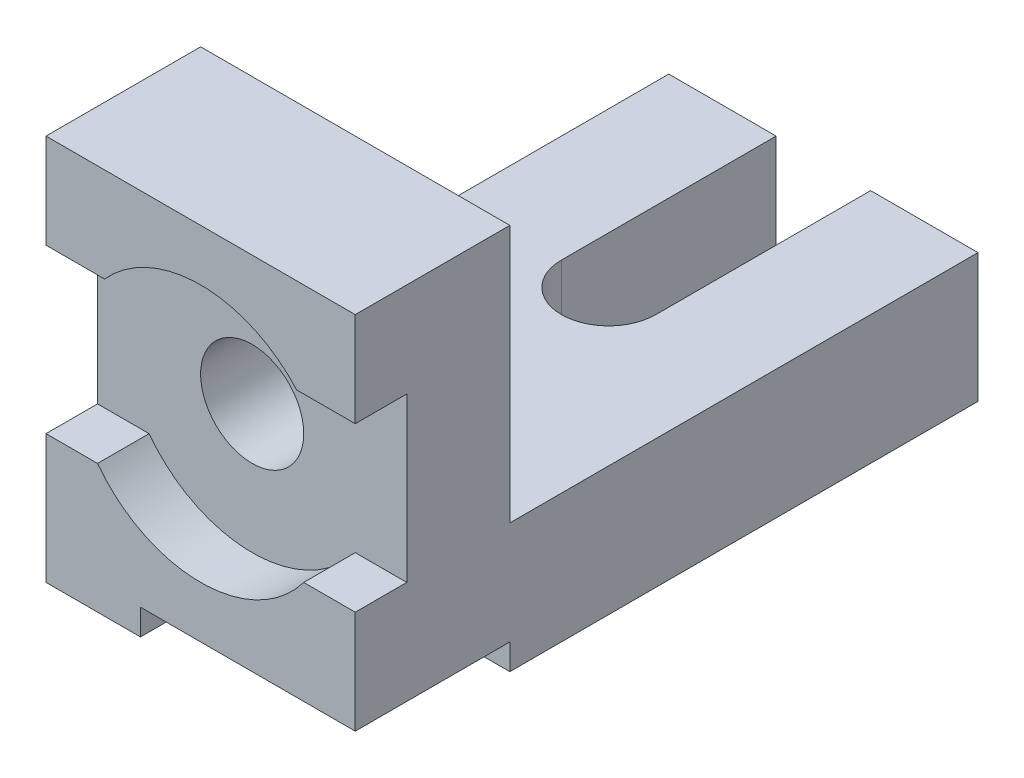
ISO-10303-21;
HEADER;
FILE_DESCRIPTION(('STEP AP214'),'2;1');
FILE_NAME('part.step','',(''),(''),'','','');
FILE_SCHEMA(('AUTOMOTIVE_DESIGN { 1 0 10303 214 1 1 1 1 }'));
ENDSEC;
DATA;
#1=APPLICATION_CONTEXT('core data for automotive mechanical design processes');
#2=APPLICATION_PROTOCOL_DEFINITION('international standard','automotive_design',2000,#1);
#3=PRODUCT_CONTEXT('',#1,'mechanical');
#4=PRODUCT('Part','Part','',(#3));
#5=PRODUCT_RELATED_PRODUCT_CATEGORY('part','',(#4));
#6=PRODUCT_DEFINITION_FORMATION('','',#4);
#7=PRODUCT_DEFINITION_CONTEXT('part definition',#1,'design');
#8=PRODUCT_DEFINITION('design','',#6,#7);
#9=PRODUCT_DEFINITION_SHAPE('','',#8);
#10=(LENGTH_UNIT() NAMED_UNIT(*) SI_UNIT(.MILLI.,.METRE.));
#11=(NAMED_UNIT(*) PLANE_ANGLE_UNIT() SI_UNIT($,.RADIAN.));
#12=(NAMED_UNIT(*) SI_UNIT($,.STERADIAN.) SOLID_ANGLE_UNIT());
#13=UNCERTAINTY_MEASURE_WITH_UNIT(LENGTH_MEASURE(1.E-05),#10,'distance_accuracy_value','');
#14=(GEOMETRIC_REPRESENTATION_CONTEXT(3) GLOBAL_UNCERTAINTY_ASSIGNED_CONTEXT((#13)) GLOBAL_UNIT_ASSIGNED_CONTEXT((#10,
#11,#12)) REPRESENTATION_CONTEXT('',''));
#15=CARTESIAN_POINT('',(0.,0.,0.));
#16=DIRECTION('',(0.,0.,1.));
#17=DIRECTION('',(1.,0.,0.));
#18=AXIS2_PLACEMENT_3D('',#15,#16,#17);
#19=CARTESIAN_POINT('',(0.,0.,-109.));
#20=DIRECTION('',(0.,0.,1.));
#21=DIRECTION('',(1.,0.,0.));
#22=AXIS2_PLACEMENT_3D('',#19,#20,#21);
#23=PLANE('',#22);
#24=DIRECTION('',(0.,1.,0.));
#25=VECTOR('',#24,1.);
#26=CARTESIAN_POINT('',(11.,-109.845971347494,-109.));
#27=LINE('',#26,#25);
#28=CARTESIAN_POINT('',(11.,-45.,-109.));
#29=VERTEX_POINT('',#28);
#30=CARTESIAN_POINT('',(11.,-15.,-109.));
#31=VERTEX_POINT('',#30);
#32=EDGE_CURVE('E240',#29,#31,#27,.T.);
#33=ORIENTED_EDGE('',*,*,#32,.T.);
#34=DIRECTION('',(-1.,0.,0.));
#35=VECTOR('',#34,1.);
#36=CARTESIAN_POINT('',(0.,-15.,-109.));
#37=LINE('',#36,#35);
#38=CARTESIAN_POINT('',(36.,-15.,-109.));
#39=VERTEX_POINT('',#38);
#40=EDGE_CURVE('E246',#39,#31,#37,.T.);
#41=ORIENTED_EDGE('',*,*,#40,.F.);
#42=DIRECTION('',(0.,-1.,0.));
#43=VECTOR('',#42,1.);
#44=CARTESIAN_POINT('',(36.,0.,-109.));
#45=LINE('',#44,#43);
#46=CARTESIAN_POINT('',(36.,-45.,-109.));
#47=VERTEX_POINT('',#46);
#48=EDGE_CURVE('E256',#39,#47,#45,.T.);
#49=ORIENTED_EDGE('',*,*,#48,.T.);
#50=DIRECTION('',(1.,0.,0.));
#51=VECTOR('',#50,1.);
#52=CARTESIAN_POINT('',(0.,-45.,-109.));
#53=LINE('',#52,#51);
#54=EDGE_CURVE('E252',#29,#47,#53,.T.);
#55=ORIENTED_EDGE('',*,*,#54,.F.);
#56=EDGE_LOOP('',(#33,#41,#49,#55));
#57=FACE_BOUND('',#56,.T.);
#58=ADVANCED_FACE('F67',(#57),#23,.F.);
#59=CARTESIAN_POINT('',(-36.,0.,24.));
#60=DIRECTION('',(1.,0.,0.));
#61=DIRECTION('',(0.,1.,0.));
#62=AXIS2_PLACEMENT_3D('',#59,#60,#61);
#63=PLANE('',#62);
#64=DIRECTION('',(0.,-1.,0.));
#65=VECTOR('',#64,1.);
#66=CARTESIAN_POINT('',(-36.,0.,0.));
#67=LINE('',#66,#65);
#68=CARTESIAN_POINT('',(-36.,45.,0.));
#69=VERTEX_POINT('',#68);
#70=CARTESIAN_POINT('',(-36.,-15.,0.));
#71=VERTEX_POINT('',#70);
#72=EDGE_CURVE('E371',#69,#71,#67,.T.);
#73=ORIENTED_EDGE('',*,*,#72,.T.);
#74=DIRECTION('',(0.,0.,1.));
#75=VECTOR('',#74,1.);
#76=CARTESIAN_POINT('',(-36.,-15.,-109.));
#77=LINE('',#76,#75);
#78=CARTESIAN_POINT('',(-36.,-15.,-109.));
#79=VERTEX_POINT('',#78);
#80=EDGE_CURVE('E92',#79,#71,#77,.T.);
#81=ORIENTED_EDGE('',*,*,#80,.F.);
#82=DIRECTION('',(0.,-1.,0.));
#83=VECTOR('',#82,1.);
#84=CARTESIAN_POINT('',(-36.,0.,-109.));
#85=LINE('',#84,#83);
#86=CARTESIAN_POINT('',(-36.,-45.,-109.));
#87=VERTEX_POINT('',#86);
#88=EDGE_CURVE('E248',#79,#87,#85,.T.);
#89=ORIENTED_EDGE('',*,*,#88,.T.);
#90=DIRECTION('',(0.,0.,-1.));
#91=VECTOR('',#90,1.);
#92=CARTESIAN_POINT('',(-36.,-45.,36.));
#93=LINE('',#92,#91);
#94=CARTESIAN_POINT('',(-36.,-45.,36.));
#95=VERTEX_POINT('',#94);
#96=EDGE_CURVE('E308',#95,#87,#93,.T.);
#97=ORIENTED_EDGE('',*,*,#96,.F.);
#98=DIRECTION('',(0.,-1.,0.));
#99=VECTOR('',#98,1.);
#100=CARTESIAN_POINT('',(-36.,0.,36.));
#101=LINE('',#100,#99);
#102=CARTESIAN_POINT('',(-36.,-15.,36.));
#103=VERTEX_POINT('',#102);
#104=EDGE_CURVE('E278',#103,#95,#101,.T.);
#105=ORIENTED_EDGE('',*,*,#104,.F.);
#106=DIRECTION('',(0.,0.,-1.));
#107=VECTOR('',#106,1.);
#108=CARTESIAN_POINT('',(-36.,-15.,36.));
#109=LINE('',#108,#107);
#110=CARTESIAN_POINT('',(-36.,-15.,24.));
#111=VERTEX_POINT('',#110);
#112=EDGE_CURVE('E310',#103,#111,#109,.T.);
#113=ORIENTED_EDGE('',*,*,#112,.T.);
#114=DIRECTION('',(0.,-1.,0.));
#115=VECTOR('',#114,1.);
#116=CARTESIAN_POINT('',(-36.,0.,24.));
#117=LINE('',#116,#115);
#118=CARTESIAN_POINT('',(-36.,23.,24.));
#119=VERTEX_POINT('',#118);
#120=EDGE_CURVE('E361',#119,#111,#117,.T.);
#121=ORIENTED_EDGE('',*,*,#120,.F.);
#122=DIRECTION('',(0.,0.,-1.));
#123=VECTOR('',#122,1.);
#124=CARTESIAN_POINT('',(-36.,23.,36.));
#125=LINE('',#124,#123);
#126=CARTESIAN_POINT('',(-36.,23.,36.));
#127=VERTEX_POINT('',#126);
#128=EDGE_CURVE('E336',#127,#119,#125,.T.);
#129=ORIENTED_EDGE('',*,*,#128,.F.);
#130=DIRECTION('',(0.,-1.,0.));
#131=VECTOR('',#130,1.);
#132=CARTESIAN_POINT('',(-36.,0.,36.));
#133=LINE('',#132,#131);
#134=CARTESIAN_POINT('',(-36.,45.,36.));
#135=VERTEX_POINT('',#134);
#136=EDGE_CURVE('E329',#135,#127,#133,.T.);
#137=ORIENTED_EDGE('',*,*,#136,.F.);
#138=DIRECTION('',(0.,0.,-1.));
#139=VECTOR('',#138,1.);
#140=CARTESIAN_POINT('',(-36.,45.,36.));
#141=LINE('',#140,#139);
#142=EDGE_CURVE('E338',#135,#69,#141,.T.);
#143=ORIENTED_EDGE('',*,*,#142,.T.);
#144=EDGE_LOOP('',(#73,#81,#89,#97,#105,#113,#121,#129,#137,#143));
#145=FACE_BOUND('',#144,.T.);
#146=ADVANCED_FACE('F434',(#145),#63,.F.);
#147=CARTESIAN_POINT('',(0.,3.00000000000001,24.));
#148=DIRECTION('',(0.,0.,-1.));
#149=DIRECTION('',(-1.,0.,0.));
#150=AXIS2_PLACEMENT_3D('',#147,#148,#149);
#151=CYLINDRICAL_SURFACE('',#150,12.);
#152=CARTESIAN_POINT('',(0.,3.00000000000001,24.));
#153=DIRECTION('',(0.,0.,1.));
#154=DIRECTION('',(1.,0.,0.));
#155=AXIS2_PLACEMENT_3D('',#152,#153,#154);
#156=CIRCLE('',#155,12.);
#157=CARTESIAN_POINT('',(12.,3.00000000000001,24.));
#158=VERTEX_POINT('',#157);
#159=EDGE_CURVE('E351',#158,#158,#156,.T.);
#160=ORIENTED_EDGE('',*,*,#159,.T.);
#161=EDGE_LOOP('',(#160));
#162=FACE_BOUND('',#161,.T.);
#163=CARTESIAN_POINT('',(0.,3.00000000000001,0.));
#164=DIRECTION('',(0.,0.,1.));
#165=DIRECTION('',(1.,0.,0.));
#166=AXIS2_PLACEMENT_3D('',#163,#164,#165);
#167=CIRCLE('',#166,12.);
#168=CARTESIAN_POINT('',(12.,3.00000000000001,0.));
#169=VERTEX_POINT('',#168);
#170=EDGE_CURVE('E350',#169,#169,#167,.T.);
#171=ORIENTED_EDGE('',*,*,#170,.F.);
#172=EDGE_LOOP('',(#171));
#173=FACE_BOUND('',#172,.T.);
#174=ADVANCED_FACE('F69',(#162,#173),#151,.F.);
#175=CARTESIAN_POINT('',(36.,0.,24.));
#176=DIRECTION('',(1.,0.,0.));
#177=DIRECTION('',(0.,1.,0.));
#178=AXIS2_PLACEMENT_3D('',#175,#176,#177);
#179=PLANE('',#178);
#180=DIRECTION('',(0.,0.,-1.));
#181=VECTOR('',#180,1.);
#182=CARTESIAN_POINT('',(36.,-39.,36.));
#183=LINE('',#182,#181);
#184=CARTESIAN_POINT('',(36.,-39.,36.));
#185=VERTEX_POINT('',#184);
#186=CARTESIAN_POINT('',(36.,-39.,0.));
#187=VERTEX_POINT('',#186);
#188=EDGE_CURVE('E299',#185,#187,#183,.T.);
#189=ORIENTED_EDGE('',*,*,#188,.T.);
#190=DIRECTION('',(0.,-1.,0.));
#191=VECTOR('',#190,1.);
#192=CARTESIAN_POINT('',(36.,0.,0.));
#193=LINE('',#192,#191);
#194=CARTESIAN_POINT('',(36.,-45.,0.));
#195=VERTEX_POINT('',#194);
#196=EDGE_CURVE('E264',#187,#195,#193,.T.);
#197=ORIENTED_EDGE('',*,*,#196,.T.);
#198=DIRECTION('',(0.,0.,1.));
#199=VECTOR('',#198,1.);
#200=CARTESIAN_POINT('',(36.,-45.,-109.));
#201=LINE('',#200,#199);
#202=EDGE_CURVE('E244',#47,#195,#201,.T.);
#203=ORIENTED_EDGE('',*,*,#202,.F.);
#204=ORIENTED_EDGE('',*,*,#48,.F.);
#205=DIRECTION('',(0.,0.,1.));
#206=VECTOR('',#205,1.);
#207=CARTESIAN_POINT('',(36.,-15.,-109.));
#208=LINE('',#207,#206);
#209=CARTESIAN_POINT('',(36.,-15.,0.));
#210=VERTEX_POINT('',#209);
#211=EDGE_CURVE('E267',#39,#210,#208,.T.);
#212=ORIENTED_EDGE('',*,*,#211,.T.);
#213=DIRECTION('',(0.,-1.,0.));
#214=VECTOR('',#213,1.);
#215=CARTESIAN_POINT('',(36.,0.,0.));
#216=LINE('',#215,#214);
#217=CARTESIAN_POINT('',(36.,45.,0.));
#218=VERTEX_POINT('',#217);
#219=EDGE_CURVE('E71',#218,#210,#216,.T.);
#220=ORIENTED_EDGE('',*,*,#219,.F.);
#221=DIRECTION('',(0.,0.,-1.));
#222=VECTOR('',#221,1.);
#223=CARTESIAN_POINT('',(36.,45.,36.));
#224=LINE('',#223,#222);
#225=CARTESIAN_POINT('',(36.,45.,36.));
#226=VERTEX_POINT('',#225);
#227=EDGE_CURVE('E341',#226,#218,#224,.T.);
#228=ORIENTED_EDGE('',*,*,#227,.F.);
#229=DIRECTION('',(0.,-1.,0.));
#230=VECTOR('',#229,1.);
#231=CARTESIAN_POINT('',(36.,0.,36.));
#232=LINE('',#231,#230);
#233=CARTESIAN_POINT('',(36.,23.,36.));
#234=VERTEX_POINT('',#233);
#235=EDGE_CURVE('E322',#226,#234,#232,.T.);
#236=ORIENTED_EDGE('',*,*,#235,.T.);
#237=DIRECTION('',(0.,0.,-1.));
#238=VECTOR('',#237,1.);
#239=CARTESIAN_POINT('',(36.,23.,36.));
#240=LINE('',#239,#238);
#241=CARTESIAN_POINT('',(36.,23.,24.));
#242=VERTEX_POINT('',#241);
#243=EDGE_CURVE('E344',#234,#242,#240,.T.);
#244=ORIENTED_EDGE('',*,*,#243,.T.);
#245=DIRECTION('',(0.,-1.,0.));
#246=VECTOR('',#245,1.);
#247=CARTESIAN_POINT('',(36.,0.,24.));
#248=LINE('',#247,#246);
#249=CARTESIAN_POINT('',(36.,-15.,24.));
#250=VERTEX_POINT('',#249);
#251=EDGE_CURVE('E12',#242,#250,#248,.T.);
#252=ORIENTED_EDGE('',*,*,#251,.T.);
#253=DIRECTION('',(0.,0.,-1.));
#254=VECTOR('',#253,1.);
#255=CARTESIAN_POINT('',(36.,-15.,36.));
#256=LINE('',#255,#254);
#257=CARTESIAN_POINT('',(36.,-15.,36.));
#258=VERTEX_POINT('',#257);
#259=EDGE_CURVE('E297',#258,#250,#256,.T.);
#260=ORIENTED_EDGE('',*,*,#259,.F.);
#261=DIRECTION('',(0.,-1.,0.));
#262=VECTOR('',#261,1.);
#263=CARTESIAN_POINT('',(36.,0.,36.));
#264=LINE('',#263,#262);
#265=EDGE_CURVE('E288',#258,#185,#264,.T.);
#266=ORIENTED_EDGE('',*,*,#265,.T.);
#267=EDGE_LOOP('',(#189,#197,#203,#204,#212,#220,#228,#236,#244,#252,#260,#266));
#268=FACE_BOUND('',#267,.T.);
#269=ADVANCED_FACE('F380',(#268),#179,.T.);
#270=CARTESIAN_POINT('',(0.,0.,24.));
#271=DIRECTION('',(0.,0.,1.));
#272=DIRECTION('',(1.,0.,0.));
#273=AXIS2_PLACEMENT_3D('',#270,#271,#272);
#274=PLANE('',#273);
#275=ORIENTED_EDGE('',*,*,#159,.F.);
#276=EDGE_LOOP('',(#275));
#277=FACE_BOUND('',#276,.T.);
#278=DIRECTION('',(1.,0.,0.));
#279=VECTOR('',#278,1.);
#280=CARTESIAN_POINT('',(0.,23.,24.));
#281=LINE('',#280,#279);
#282=CARTESIAN_POINT('',(22.3606797749979,23.,24.));
#283=VERTEX_POINT('',#282);
#284=EDGE_CURVE('E354',#283,#242,#281,.T.);
#285=ORIENTED_EDGE('',*,*,#284,.F.);
#286=CARTESIAN_POINT('',(0.,3.00000000000001,24.));
#287=DIRECTION('',(0.,0.,1.));
#288=DIRECTION('',(1.,0.,0.));
#289=AXIS2_PLACEMENT_3D('',#286,#287,#288);
#290=CIRCLE('',#289,30.);
#291=CARTESIAN_POINT('',(-22.3606797749979,23.,24.));
#292=VERTEX_POINT('',#291);
#293=EDGE_CURVE('E356',#283,#292,#290,.T.);
#294=ORIENTED_EDGE('',*,*,#293,.T.);
#295=DIRECTION('',(1.,0.,0.));
#296=VECTOR('',#295,1.);
#297=CARTESIAN_POINT('',(0.,23.,24.));
#298=LINE('',#297,#296);
#299=EDGE_CURVE('E359',#119,#292,#298,.T.);
#300=ORIENTED_EDGE('',*,*,#299,.F.);
#301=ORIENTED_EDGE('',*,*,#120,.T.);
#302=DIRECTION('',(-1.,0.,0.));
#303=VECTOR('',#302,1.);
#304=CARTESIAN_POINT('',(0.,-15.,24.));
#305=LINE('',#304,#303);
#306=CARTESIAN_POINT('',(-24.,-15.,24.));
#307=VERTEX_POINT('',#306);
#308=EDGE_CURVE('E364',#307,#111,#305,.T.);
#309=ORIENTED_EDGE('',*,*,#308,.F.);
#310=CARTESIAN_POINT('',(0.,3.00000000000001,24.));
#311=DIRECTION('',(0.,0.,1.));
#312=DIRECTION('',(1.,0.,0.));
#313=AXIS2_PLACEMENT_3D('',#310,#311,#312);
#314=CIRCLE('',#313,30.);
#315=CARTESIAN_POINT('',(24.,-15.,24.));
#316=VERTEX_POINT('',#315);
#317=EDGE_CURVE('E366',#307,#316,#314,.T.);
#318=ORIENTED_EDGE('',*,*,#317,.T.);
#319=DIRECTION('',(-1.,0.,0.));
#320=VECTOR('',#319,1.);
#321=CARTESIAN_POINT('',(0.,-15.,24.));
#322=LINE('',#321,#320);
#323=EDGE_CURVE('E76',#250,#316,#322,.T.);
#324=ORIENTED_EDGE('',*,*,#323,.F.);
#325=ORIENTED_EDGE('',*,*,#251,.F.);
#326=EDGE_LOOP('',(#285,#294,#300,#301,#309,#318,#324,#325));
#327=FACE_BOUND('',#326,.T.);
#328=ADVANCED_FACE('F398',(#277,#327),#274,.T.);
#329=CARTESIAN_POINT('',(0.,0.,0.));
#330=DIRECTION('',(0.,0.,1.));
#331=DIRECTION('',(1.,0.,0.));
#332=AXIS2_PLACEMENT_3D('',#329,#330,#331);
#333=PLANE('',#332);
#334=ORIENTED_EDGE('',*,*,#219,.T.);
#335=DIRECTION('',(-1.,0.,0.));
#336=VECTOR('',#335,1.);
#337=CARTESIAN_POINT('',(0.,-15.,0.));
#338=LINE('',#337,#336);
#339=EDGE_CURVE('E259',#210,#71,#338,.T.);
#340=ORIENTED_EDGE('',*,*,#339,.T.);
#341=ORIENTED_EDGE('',*,*,#72,.F.);
#342=DIRECTION('',(1.,0.,0.));
#343=VECTOR('',#342,1.);
#344=CARTESIAN_POINT('',(0.,45.,0.));
#345=LINE('',#344,#343);
#346=EDGE_CURVE('E316',#69,#218,#345,.T.);
#347=ORIENTED_EDGE('',*,*,#346,.T.);
#348=EDGE_LOOP('',(#334,#340,#341,#347));
#349=FACE_BOUND('',#348,.T.);
#350=ORIENTED_EDGE('',*,*,#170,.T.);
#351=EDGE_LOOP('',(#350));
#352=FACE_BOUND('',#351,.T.);
#353=ADVANCED_FACE('F376',(#349,#352),#333,.F.);
#354=CARTESIAN_POINT('',(0.,3.00000000000001,36.));
#355=DIRECTION('',(0.,0.,-1.));
#356=DIRECTION('',(-1.,0.,0.));
#357=AXIS2_PLACEMENT_3D('',#354,#355,#356);
#358=CYLINDRICAL_SURFACE('',#357,30.);
#359=DIRECTION('',(0.,0.,-1.));
#360=VECTOR('',#359,1.);
#361=CARTESIAN_POINT('',(-22.3606797749979,23.,36.));
#362=LINE('',#361,#360);
#363=CARTESIAN_POINT('',(-22.3606797749979,23.,36.));
#364=VERTEX_POINT('',#363);
#365=EDGE_CURVE('E333',#364,#292,#362,.T.);
#366=ORIENTED_EDGE('',*,*,#365,.T.);
#367=ORIENTED_EDGE('',*,*,#293,.F.);
#368=DIRECTION('',(0.,0.,-1.));
#369=VECTOR('',#368,1.);
#370=CARTESIAN_POINT('',(22.3606797749979,23.,36.));
#371=LINE('',#370,#369);
#372=CARTESIAN_POINT('',(22.3606797749979,23.,36.));
#373=VERTEX_POINT('',#372);
#374=EDGE_CURVE('E347',#373,#283,#371,.T.);
#375=ORIENTED_EDGE('',*,*,#374,.F.);
#376=CARTESIAN_POINT('',(0.,3.00000000000001,36.));
#377=DIRECTION('',(0.,0.,1.));
#378=DIRECTION('',(1.,0.,0.));
#379=AXIS2_PLACEMENT_3D('',#376,#377,#378);
#380=CIRCLE('',#379,30.);
#381=EDGE_CURVE('E317',#373,#364,#380,.T.);
#382=ORIENTED_EDGE('',*,*,#381,.T.);
#383=EDGE_LOOP('',(#366,#367,#375,#382));
#384=FACE_BOUND('',#383,.T.);
#385=ADVANCED_FACE('F448',(#384),#358,.F.);
#386=CARTESIAN_POINT('',(0.,23.,36.));
#387=DIRECTION('',(0.,1.,0.));
#388=DIRECTION('',(0.,0.,1.));
#389=AXIS2_PLACEMENT_3D('',#386,#387,#388);
#390=PLANE('',#389);
#391=ORIENTED_EDGE('',*,*,#284,.T.);
#392=ORIENTED_EDGE('',*,*,#243,.F.);
#393=DIRECTION('',(1.,0.,0.));
#394=VECTOR('',#393,1.);
#395=CARTESIAN_POINT('',(0.,23.,36.));
#396=LINE('',#395,#394);
#397=EDGE_CURVE('E320',#373,#234,#396,.T.);
#398=ORIENTED_EDGE('',*,*,#397,.F.);
#399=ORIENTED_EDGE('',*,*,#374,.T.);
#400=EDGE_LOOP('',(#391,#392,#398,#399));
#401=FACE_BOUND('',#400,.T.);
#402=ADVANCED_FACE('F454',(#401),#390,.F.);
#403=CARTESIAN_POINT('',(0.,45.,36.));
#404=DIRECTION('',(0.,1.,0.));
#405=DIRECTION('',(0.,0.,1.));
#406=AXIS2_PLACEMENT_3D('',#403,#404,#405);
#407=PLANE('',#406);
#408=ORIENTED_EDGE('',*,*,#346,.F.);
#409=ORIENTED_EDGE('',*,*,#142,.F.);
#410=DIRECTION('',(1.,0.,0.));
#411=VECTOR('',#410,1.);
#412=CARTESIAN_POINT('',(0.,45.,36.));
#413=LINE('',#412,#411);
#414=EDGE_CURVE('E326',#135,#226,#413,.T.);
#415=ORIENTED_EDGE('',*,*,#414,.T.);
#416=ORIENTED_EDGE('',*,*,#227,.T.);
#417=EDGE_LOOP('',(#408,#409,#415,#416));
#418=FACE_BOUND('',#417,.T.);
#419=ADVANCED_FACE('F384',(#418),#407,.T.);
#420=ORIENTED_EDGE('',*,*,#299,.T.);
#421=ORIENTED_EDGE('',*,*,#365,.F.);
#422=EDGE_CURVE('E323',#127,#364,#396,.T.);
#423=ORIENTED_EDGE('',*,*,#422,.F.);
#424=ORIENTED_EDGE('',*,*,#128,.T.);
#425=EDGE_LOOP('',(#420,#421,#423,#424));
#426=FACE_BOUND('',#425,.T.);
#427=ADVANCED_FACE('F458',(#426),#390,.F.);
#428=CARTESIAN_POINT('',(0.,0.,36.));
#429=DIRECTION('',(0.,0.,1.));
#430=DIRECTION('',(1.,0.,0.));
#431=AXIS2_PLACEMENT_3D('',#428,#429,#430);
#432=PLANE('',#431);
#433=ORIENTED_EDGE('',*,*,#381,.F.);
#434=ORIENTED_EDGE('',*,*,#397,.T.);
#435=ORIENTED_EDGE('',*,*,#235,.F.);
#436=ORIENTED_EDGE('',*,*,#414,.F.);
#437=ORIENTED_EDGE('',*,*,#136,.T.);
#438=ORIENTED_EDGE('',*,*,#422,.T.);
#439=EDGE_LOOP('',(#433,#434,#435,#436,#437,#438));
#440=FACE_BOUND('',#439,.T.);
#441=ADVANCED_FACE('F389',(#440),#432,.T.);
#442=CARTESIAN_POINT('',(0.,3.00000000000001,36.));
#443=DIRECTION('',(0.,0.,-1.));
#444=DIRECTION('',(-1.,0.,0.));
#445=AXIS2_PLACEMENT_3D('',#442,#443,#444);
#446=CYLINDRICAL_SURFACE('',#445,30.);
#447=DIRECTION('',(0.,0.,-1.));
#448=VECTOR('',#447,1.);
#449=CARTESIAN_POINT('',(24.,-15.,36.));
#450=LINE('',#449,#448);
#451=CARTESIAN_POINT('',(24.,-15.,36.));
#452=VERTEX_POINT('',#451);
#453=EDGE_CURVE('E294',#452,#316,#450,.T.);
#454=ORIENTED_EDGE('',*,*,#453,.T.);
#455=ORIENTED_EDGE('',*,*,#317,.F.);
#456=DIRECTION('',(0.,0.,-1.));
#457=VECTOR('',#456,1.);
#458=CARTESIAN_POINT('',(-24.,-15.,36.));
#459=LINE('',#458,#457);
#460=CARTESIAN_POINT('',(-24.,-15.,36.));
#461=VERTEX_POINT('',#460);
#462=EDGE_CURVE('E313',#461,#307,#459,.T.);
#463=ORIENTED_EDGE('',*,*,#462,.F.);
#464=CARTESIAN_POINT('',(0.,3.00000000000001,36.));
#465=DIRECTION('',(0.,0.,1.));
#466=DIRECTION('',(1.,0.,0.));
#467=AXIS2_PLACEMENT_3D('',#464,#465,#466);
#468=CIRCLE('',#467,30.);
#469=EDGE_CURVE('E272',#461,#452,#468,.T.);
#470=ORIENTED_EDGE('',*,*,#469,.T.);
#471=EDGE_LOOP('',(#454,#455,#463,#470));
#472=FACE_BOUND('',#471,.T.);
#473=ADVANCED_FACE('F405',(#472),#446,.F.);
#474=CARTESIAN_POINT('',(0.,-15.,36.));
#475=DIRECTION('',(0.,-1.,0.));
#476=DIRECTION('',(1.,0.,0.));
#477=AXIS2_PLACEMENT_3D('',#474,#475,#476);
#478=PLANE('',#477);
#479=ORIENTED_EDGE('',*,*,#308,.T.);
#480=ORIENTED_EDGE('',*,*,#112,.F.);
#481=DIRECTION('',(-1.,0.,0.));
#482=VECTOR('',#481,1.);
#483=CARTESIAN_POINT('',(0.,-15.,36.));
#484=LINE('',#483,#482);
#485=EDGE_CURVE('E275',#461,#103,#484,.T.);
#486=ORIENTED_EDGE('',*,*,#485,.F.);
#487=ORIENTED_EDGE('',*,*,#462,.T.);
#488=EDGE_LOOP('',(#479,#480,#486,#487));
#489=FACE_BOUND('',#488,.T.);
#490=ADVANCED_FACE('F466',(#489),#478,.F.);
#491=CARTESIAN_POINT('',(0.,-45.,36.));
#492=DIRECTION('',(0.,1.,0.));
#493=DIRECTION('',(-1.,0.,0.));
#494=AXIS2_PLACEMENT_3D('',#491,#492,#493);
#495=PLANE('',#494);
#496=CARTESIAN_POINT('',(-11.,-45.,-109.));
#497=VERTEX_POINT('',#496);
#498=EDGE_CURVE('E253',#87,#497,#53,.T.);
#499=ORIENTED_EDGE('',*,*,#498,.T.);
#500=DIRECTION('',(0.,0.,-1.));
#501=VECTOR('',#500,1.);
#502=CARTESIAN_POINT('',(-11.,-45.,0.));
#503=LINE('',#502,#501);
#504=CARTESIAN_POINT('',(-11.,-45.,-59.));
#505=VERTEX_POINT('',#504);
#506=EDGE_CURVE('E245',#505,#497,#503,.T.);
#507=ORIENTED_EDGE('',*,*,#506,.F.);
#508=CARTESIAN_POINT('',(0.,-45.,-59.));
#509=DIRECTION('',(0.,1.,0.));
#510=DIRECTION('',(-1.,0.,0.));
#511=AXIS2_PLACEMENT_3D('',#508,#509,#510);
#512=CIRCLE('',#511,11.);
#513=CARTESIAN_POINT('',(11.,-45.,-59.));
#514=VERTEX_POINT('',#513);
#515=EDGE_CURVE('E220',#514,#505,#512,.F.);
#516=ORIENTED_EDGE('',*,*,#515,.F.);
#517=DIRECTION('',(0.,0.,-1.));
#518=VECTOR('',#517,1.);
#519=CARTESIAN_POINT('',(11.,-45.,0.));
#520=LINE('',#519,#518);
#521=EDGE_CURVE('E239',#514,#29,#520,.T.);
#522=ORIENTED_EDGE('',*,*,#521,.T.);
#523=ORIENTED_EDGE('',*,*,#54,.T.);
#524=ORIENTED_EDGE('',*,*,#202,.T.);
#525=DIRECTION('',(1.,0.,0.));
#526=VECTOR('',#525,1.);
#527=CARTESIAN_POINT('',(0.,-45.,0.));
#528=LINE('',#527,#526);
#529=CARTESIAN_POINT('',(-14.,-45.,0.));
#530=VERTEX_POINT('',#529);
#531=EDGE_CURVE('E261',#530,#195,#528,.T.);
#532=ORIENTED_EDGE('',*,*,#531,.F.);
#533=DIRECTION('',(0.,0.,-1.));
#534=VECTOR('',#533,1.);
#535=CARTESIAN_POINT('',(-14.,-45.,36.));
#536=LINE('',#535,#534);
#537=CARTESIAN_POINT('',(-14.,-45.,36.));
#538=VERTEX_POINT('',#537);
#539=EDGE_CURVE('E305',#538,#530,#536,.T.);
#540=ORIENTED_EDGE('',*,*,#539,.F.);
#541=DIRECTION('',(1.,0.,0.));
#542=VECTOR('',#541,1.);
#543=CARTESIAN_POINT('',(0.,-45.,36.));
#544=LINE('',#543,#542);
#545=EDGE_CURVE('E281',#95,#538,#544,.T.);
#546=ORIENTED_EDGE('',*,*,#545,.F.);
#547=ORIENTED_EDGE('',*,*,#96,.T.);
#548=EDGE_LOOP('',(#499,#507,#516,#522,#523,#524,#532,#540,#546,#547));
#549=FACE_BOUND('',#548,.T.);
#550=ADVANCED_FACE('F423',(#549),#495,.F.);
#551=CARTESIAN_POINT('',(-14.,0.,36.));
#552=DIRECTION('',(-1.,0.,0.));
#553=DIRECTION('',(0.,0.,1.));
#554=AXIS2_PLACEMENT_3D('',#551,#552,#553);
#555=PLANE('',#554);
#556=DIRECTION('',(0.,1.,0.));
#557=VECTOR('',#556,1.);
#558=CARTESIAN_POINT('',(-14.,0.,0.));
#559=LINE('',#558,#557);
#560=CARTESIAN_POINT('',(-14.,-39.,0.));
#561=VERTEX_POINT('',#560);
#562=EDGE_CURVE('E269',#530,#561,#559,.T.);
#563=ORIENTED_EDGE('',*,*,#562,.T.);
#564=DIRECTION('',(0.,0.,-1.));
#565=VECTOR('',#564,1.);
#566=CARTESIAN_POINT('',(-14.,-39.,36.));
#567=LINE('',#566,#565);
#568=CARTESIAN_POINT('',(-14.,-39.,36.));
#569=VERTEX_POINT('',#568);
#570=EDGE_CURVE('E302',#569,#561,#567,.T.);
#571=ORIENTED_EDGE('',*,*,#570,.F.);
#572=DIRECTION('',(0.,1.,0.));
#573=VECTOR('',#572,1.);
#574=CARTESIAN_POINT('',(-14.,0.,36.));
#575=LINE('',#574,#573);
#576=EDGE_CURVE('E283',#538,#569,#575,.T.);
#577=ORIENTED_EDGE('',*,*,#576,.F.);
#578=ORIENTED_EDGE('',*,*,#539,.T.);
#579=EDGE_LOOP('',(#563,#571,#577,#578));
#580=FACE_BOUND('',#579,.T.);
#581=ADVANCED_FACE('F427',(#580),#555,.F.);
#582=CARTESIAN_POINT('',(0.,-39.,36.));
#583=DIRECTION('',(0.,-1.,0.));
#584=DIRECTION('',(1.,0.,0.));
#585=AXIS2_PLACEMENT_3D('',#582,#583,#584);
#586=PLANE('',#585);
#587=DIRECTION('',(-1.,0.,0.));
#588=VECTOR('',#587,1.);
#589=CARTESIAN_POINT('',(0.,-39.,0.));
#590=LINE('',#589,#588);
#591=EDGE_CURVE('E276',#187,#561,#590,.T.);
#592=ORIENTED_EDGE('',*,*,#591,.F.);
#593=ORIENTED_EDGE('',*,*,#188,.F.);
#594=DIRECTION('',(-1.,0.,0.));
#595=VECTOR('',#594,1.);
#596=CARTESIAN_POINT('',(0.,-39.,36.));
#597=LINE('',#596,#595);
#598=EDGE_CURVE('E285',#185,#569,#597,.T.);
#599=ORIENTED_EDGE('',*,*,#598,.T.);
#600=ORIENTED_EDGE('',*,*,#570,.T.);
#601=EDGE_LOOP('',(#592,#593,#599,#600));
#602=FACE_BOUND('',#601,.T.);
#603=ADVANCED_FACE('F416',(#602),#586,.T.);
#604=ORIENTED_EDGE('',*,*,#323,.T.);
#605=ORIENTED_EDGE('',*,*,#453,.F.);
#606=EDGE_CURVE('E279',#258,#452,#484,.T.);
#607=ORIENTED_EDGE('',*,*,#606,.F.);
#608=ORIENTED_EDGE('',*,*,#259,.T.);
#609=EDGE_LOOP('',(#604,#605,#607,#608));
#610=FACE_BOUND('',#609,.T.);
#611=ADVANCED_FACE('F402',(#610),#478,.F.);
#612=CARTESIAN_POINT('',(0.,0.,36.));
#613=DIRECTION('',(0.,0.,1.));
#614=DIRECTION('',(1.,0.,0.));
#615=AXIS2_PLACEMENT_3D('',#612,#613,#614);
#616=PLANE('',#615);
#617=ORIENTED_EDGE('',*,*,#469,.F.);
#618=ORIENTED_EDGE('',*,*,#485,.T.);
#619=ORIENTED_EDGE('',*,*,#104,.T.);
#620=ORIENTED_EDGE('',*,*,#545,.T.);
#621=ORIENTED_EDGE('',*,*,#576,.T.);
#622=ORIENTED_EDGE('',*,*,#598,.F.);
#623=ORIENTED_EDGE('',*,*,#265,.F.);
#624=ORIENTED_EDGE('',*,*,#606,.T.);
#625=EDGE_LOOP('',(#617,#618,#619,#620,#621,#622,#623,#624));
#626=FACE_BOUND('',#625,.T.);
#627=ADVANCED_FACE('F409',(#626),#616,.T.);
#628=CARTESIAN_POINT('',(0.,-15.,-109.));
#629=DIRECTION('',(0.,1.,0.));
#630=DIRECTION('',(-1.,0.,0.));
#631=AXIS2_PLACEMENT_3D('',#628,#629,#630);
#632=PLANE('',#631);
#633=DIRECTION('',(0.,0.,1.));
#634=VECTOR('',#633,1.);
#635=CARTESIAN_POINT('',(-11.,-15.,0.));
#636=LINE('',#635,#634);
#637=CARTESIAN_POINT('',(-11.,-15.,-109.));
#638=VERTEX_POINT('',#637);
#639=CARTESIAN_POINT('',(-11.,-15.,-59.));
#640=VERTEX_POINT('',#639);
#641=EDGE_CURVE('E226',#638,#640,#636,.T.);
#642=ORIENTED_EDGE('',*,*,#641,.F.);
#643=EDGE_CURVE('E249',#638,#79,#37,.T.);
#644=ORIENTED_EDGE('',*,*,#643,.T.);
#645=ORIENTED_EDGE('',*,*,#80,.T.);
#646=ORIENTED_EDGE('',*,*,#339,.F.);
#647=ORIENTED_EDGE('',*,*,#211,.F.);
#648=ORIENTED_EDGE('',*,*,#40,.T.);
#649=DIRECTION('',(0.,0.,1.));
#650=VECTOR('',#649,1.);
#651=CARTESIAN_POINT('',(11.,-15.,0.));
#652=LINE('',#651,#650);
#653=CARTESIAN_POINT('',(11.,-15.,-59.));
#654=VERTEX_POINT('',#653);
#655=EDGE_CURVE('E84',#31,#654,#652,.T.);
#656=ORIENTED_EDGE('',*,*,#655,.T.);
#657=CARTESIAN_POINT('',(0.,-15.,-59.));
#658=DIRECTION('',(0.,1.,0.));
#659=DIRECTION('',(-1.,0.,0.));
#660=AXIS2_PLACEMENT_3D('',#657,#658,#659);
#661=CIRCLE('',#660,11.);
#662=EDGE_CURVE('E218',#640,#654,#661,.T.);
#663=ORIENTED_EDGE('',*,*,#662,.F.);
#664=EDGE_LOOP('',(#642,#644,#645,#646,#647,#648,#656,#663));
#665=FACE_BOUND('',#664,.T.);
#666=ADVANCED_FACE('F232',(#665),#632,.T.);
#667=CARTESIAN_POINT('',(0.,0.,0.));
#668=DIRECTION('',(0.,0.,1.));
#669=DIRECTION('',(1.,0.,0.));
#670=AXIS2_PLACEMENT_3D('',#667,#668,#669);
#671=PLANE('',#670);
#672=ORIENTED_EDGE('',*,*,#196,.F.);
#673=ORIENTED_EDGE('',*,*,#591,.T.);
#674=ORIENTED_EDGE('',*,*,#562,.F.);
#675=ORIENTED_EDGE('',*,*,#531,.T.);
#676=EDGE_LOOP('',(#672,#673,#674,#675));
#677=FACE_BOUND('',#676,.T.);
#678=ADVANCED_FACE('F419',(#677),#671,.T.);
#679=ORIENTED_EDGE('',*,*,#643,.F.);
#680=DIRECTION('',(0.,1.,0.));
#681=VECTOR('',#680,1.);
#682=CARTESIAN_POINT('',(-11.,-109.845971347494,-109.));
#683=LINE('',#682,#681);
#684=EDGE_CURVE('E229',#497,#638,#683,.T.);
#685=ORIENTED_EDGE('',*,*,#684,.F.);
#686=ORIENTED_EDGE('',*,*,#498,.F.);
#687=ORIENTED_EDGE('',*,*,#88,.F.);
#688=EDGE_LOOP('',(#679,#685,#686,#687));
#689=FACE_BOUND('',#688,.T.);
#690=ADVANCED_FACE('F433',(#689),#23,.F.);
#691=CARTESIAN_POINT('',(-11.,-109.845971347494,0.));
#692=DIRECTION('',(-1.,0.,0.));
#693=DIRECTION('',(0.,-1.,0.));
#694=AXIS2_PLACEMENT_3D('',#691,#692,#693);
#695=PLANE('',#694);
#696=ORIENTED_EDGE('',*,*,#506,.T.);
#697=ORIENTED_EDGE('',*,*,#684,.T.);
#698=ORIENTED_EDGE('',*,*,#641,.T.);
#699=DIRECTION('',(0.,1.,0.));
#700=VECTOR('',#699,1.);
#701=CARTESIAN_POINT('',(-11.,-109.845971347494,-59.));
#702=LINE('',#701,#700);
#703=EDGE_CURVE('E213',#505,#640,#702,.T.);
#704=ORIENTED_EDGE('',*,*,#703,.F.);
#705=EDGE_LOOP('',(#696,#697,#698,#704));
#706=FACE_BOUND('',#705,.T.);
#707=ADVANCED_FACE('F227',(#706),#695,.F.);
#708=CARTESIAN_POINT('',(11.,-109.845971347494,0.));
#709=DIRECTION('',(-1.,0.,0.));
#710=DIRECTION('',(0.,-1.,0.));
#711=AXIS2_PLACEMENT_3D('',#708,#709,#710);
#712=PLANE('',#711);
#713=DIRECTION('',(0.,1.,0.));
#714=VECTOR('',#713,1.);
#715=CARTESIAN_POINT('',(11.,-109.845971347494,-59.));
#716=LINE('',#715,#714);
#717=EDGE_CURVE('E223',#514,#654,#716,.T.);
#718=ORIENTED_EDGE('',*,*,#717,.T.);
#719=ORIENTED_EDGE('',*,*,#655,.F.);
#720=ORIENTED_EDGE('',*,*,#32,.F.);
#721=ORIENTED_EDGE('',*,*,#521,.F.);
#722=EDGE_LOOP('',(#718,#719,#720,#721));
#723=FACE_BOUND('',#722,.T.);
#724=ADVANCED_FACE('F484',(#723),#712,.T.);
#725=CARTESIAN_POINT('',(0.,-109.845971347494,-59.));
#726=DIRECTION('',(0.,1.,0.));
#727=DIRECTION('',(-1.,0.,0.));
#728=AXIS2_PLACEMENT_3D('',#725,#726,#727);
#729=CYLINDRICAL_SURFACE('',#728,11.);
#730=ORIENTED_EDGE('',*,*,#515,.T.);
#731=ORIENTED_EDGE('',*,*,#703,.T.);
#732=ORIENTED_EDGE('',*,*,#662,.T.);
#733=ORIENTED_EDGE('',*,*,#717,.F.);
#734=EDGE_LOOP('',(#730,#731,#732,#733));
#735=FACE_BOUND('',#734,.T.);
#736=ADVANCED_FACE('F215',(#735),#729,.F.);
#737=CLOSED_SHELL('',(#58,#146,#174,#269,#328,#353,#385,#402,#419,#427,#441,#473,#490,#550,#581,
#603,#611,#627,#666,#678,#690,#707,#724,#736));
#738=MANIFOLD_SOLID_BREP('B2',#737);
#739=ADVANCED_BREP_SHAPE_REPRESENTATION('',(#18,#738),#14);
#740=SHAPE_DEFINITION_REPRESENTATION(#9,#739);
ENDSEC;
END-ISO-10303-21;
